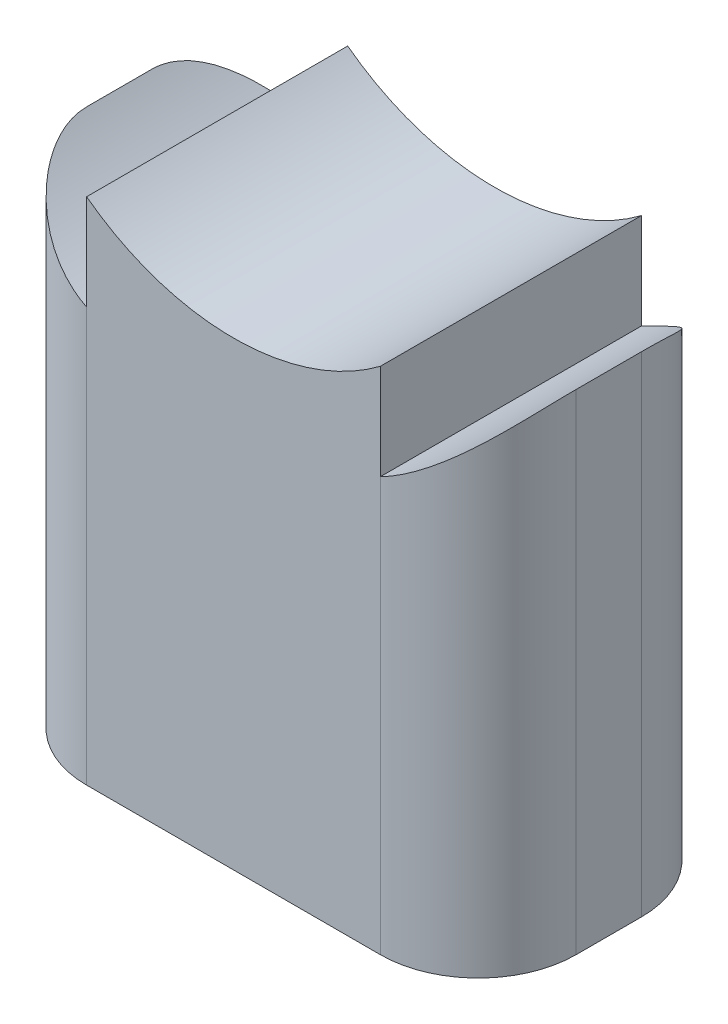
ISO-10303-21;
HEADER;
FILE_DESCRIPTION(('STEP AP214'),'2;1');
FILE_NAME('part.step','',(''),(''),'','','');
FILE_SCHEMA(('AUTOMOTIVE_DESIGN { 1 0 10303 214 1 1 1 1 }'));
ENDSEC;
DATA;
#1=APPLICATION_CONTEXT('core data for automotive mechanical design processes');
#2=APPLICATION_PROTOCOL_DEFINITION('international standard','automotive_design',2000,#1);
#3=PRODUCT_CONTEXT('',#1,'mechanical');
#4=PRODUCT('Part','Part','',(#3));
#5=PRODUCT_RELATED_PRODUCT_CATEGORY('part','',(#4));
#6=PRODUCT_DEFINITION_FORMATION('','',#4);
#7=PRODUCT_DEFINITION_CONTEXT('part definition',#1,'design');
#8=PRODUCT_DEFINITION('design','',#6,#7);
#9=PRODUCT_DEFINITION_SHAPE('','',#8);
#10=(LENGTH_UNIT() NAMED_UNIT(*) SI_UNIT(.MILLI.,.METRE.));
#11=(NAMED_UNIT(*) PLANE_ANGLE_UNIT() SI_UNIT($,.RADIAN.));
#12=(NAMED_UNIT(*) SI_UNIT($,.STERADIAN.) SOLID_ANGLE_UNIT());
#13=UNCERTAINTY_MEASURE_WITH_UNIT(LENGTH_MEASURE(1.E-05),#10,'distance_accuracy_value','');
#14=(GEOMETRIC_REPRESENTATION_CONTEXT(3) GLOBAL_UNCERTAINTY_ASSIGNED_CONTEXT((#13)) GLOBAL_UNIT_ASSIGNED_CONTEXT((#10,
#11,#12)) REPRESENTATION_CONTEXT('',''));
#15=CARTESIAN_POINT('',(0.,0.,0.));
#16=DIRECTION('',(0.,0.,1.));
#17=DIRECTION('',(1.,0.,0.));
#18=AXIS2_PLACEMENT_3D('',#15,#16,#17);
#19=CARTESIAN_POINT('',(0.,216.143782776615,-40.));
#20=DIRECTION('',(0.,0.,1.));
#21=DIRECTION('',(1.,0.,0.));
#22=AXIS2_PLACEMENT_3D('',#19,#20,#21);
#23=CYLINDRICAL_SURFACE('',#22,100.);
#24=DIRECTION('',(0.,0.,1.));
#25=VECTOR('',#24,1.);
#26=CARTESIAN_POINT('',(-45.,126.840927279156,-40.));
#27=LINE('',#26,#25);
#28=CARTESIAN_POINT('',(-45.,126.840927279156,-40.));
#29=VERTEX_POINT('',#28);
#30=CARTESIAN_POINT('',(-45.,126.840927279156,40.));
#31=VERTEX_POINT('',#30);
#32=EDGE_CURVE('E194',#29,#31,#27,.T.);
#33=ORIENTED_EDGE('',*,*,#32,.F.);
#34=CARTESIAN_POINT('',(-45.,126.840927279156,-40.));
#35=CARTESIAN_POINT('',(-45.5757367420864,127.13101910716,-40.0000043916286));
#36=CARTESIAN_POINT('',(-46.1485951016045,127.426688632291,-39.9834272360562));
#37=CARTESIAN_POINT('',(-47.2869642823122,128.028198258152,-39.9181331090478));
#38=CARTESIAN_POINT('',(-47.8524764832853,128.334036409407,-39.8694222647558));
#39=CARTESIAN_POINT('',(-48.97419085297,128.95468202613,-39.7409511060226));
#40=CARTESIAN_POINT('',(-49.5304022191007,129.269479682922,-39.6612236212749));
#41=CARTESIAN_POINT('',(-50.6328352703408,129.907352940028,-39.4717502912824));
#42=CARTESIAN_POINT('',(-51.1790564935028,130.230428921483,-39.3620030616401));
#43=CARTESIAN_POINT('',(-52.7960792554557,131.207610194835,-38.9903516916841));
#44=CARTESIAN_POINT('',(-53.8506817694574,131.872686801489,-38.6853967758538));
#45=CARTESIAN_POINT('',(-55.9084978112686,133.223603566237,-37.9677127816937));
#46=CARTESIAN_POINT('',(-56.9117032050814,133.909446983684,-37.5549667072047));
#47=CARTESIAN_POINT('',(-58.7101550104845,135.186146019313,-36.6995103673227));
#48=CARTESIAN_POINT('',(-59.5135672064256,135.775286396405,-36.2713083091998));
#49=CARTESIAN_POINT('',(-61.0765234708819,136.956552119113,-35.3450297279042));
#50=CARTESIAN_POINT('',(-61.8360742592796,137.548676992289,-34.8469639486644));
#51=CARTESIAN_POINT('',(-63.3093353038687,138.730470626186,-33.7822473124236));
#52=CARTESIAN_POINT('',(-64.0229940470094,139.320135955303,-33.2155213738746));
#53=CARTESIAN_POINT('',(-65.4004294573984,140.489308385403,-32.0149294224547));
#54=CARTESIAN_POINT('',(-66.0642108104681,141.068816436698,-31.3810697301004));
#55=CARTESIAN_POINT('',(-67.2439717505546,142.125005708197,-30.1450659397892));
#56=CARTESIAN_POINT('',(-67.7672944003767,142.604222870249,-29.5520867567658));
#57=CARTESIAN_POINT('',(-68.7722167484446,143.543129547488,-28.3170814680476));
#58=CARTESIAN_POINT('',(-69.2538151063079,144.002818435092,-27.675053787928));
#59=CARTESIAN_POINT('',(-70.1709975810188,144.89464422499,-26.3424107229824));
#60=CARTESIAN_POINT('',(-70.6066412481728,145.326816489281,-25.6518602000576));
#61=CARTESIAN_POINT('',(-71.4279195019786,146.155267804472,-24.22127970621));
#62=CARTESIAN_POINT('',(-71.8135725560361,146.551560093655,-23.4812681610499));
#63=CARTESIAN_POINT('',(-72.4283693562941,147.192571468004,-22.1676728703065));
#64=CARTESIAN_POINT('',(-72.6710120377248,147.448557183229,-21.6058733532663));
#65=CARTESIAN_POINT('',(-73.1250024914224,147.932024810267,-20.4577791702395));
#66=CARTESIAN_POINT('',(-73.3363519391253,148.159508247988,-19.8714858178064));
#67=CARTESIAN_POINT('',(-73.7243806102935,148.580497599438,-18.6777137425133));
#68=CARTESIAN_POINT('',(-73.901159678204,148.774101187723,-18.0703021813719));
#69=CARTESIAN_POINT('',(-74.2178927607972,149.123188286726,-16.8352586527849));
#70=CARTESIAN_POINT('',(-74.3578568773827,149.278682253798,-16.2076322853847));
#71=CARTESIAN_POINT('',(-74.5633646554144,149.508049705912,-15.1204185199746));
#72=CARTESIAN_POINT('',(-74.6387192259403,149.592516036522,-14.6648843785734));
#73=CARTESIAN_POINT('',(-74.7686469198415,149.738519246444,-13.7473000978595));
#74=CARTESIAN_POINT('',(-74.8232249874925,149.800061581006,-13.2852515359884));
#75=CARTESIAN_POINT('',(-74.9111792648944,149.89938918166,-12.3539819561348));
#76=CARTESIAN_POINT('',(-74.9444383983732,149.937043250188,-11.884735581579));
#77=CARTESIAN_POINT('',(-74.9777491159797,149.974776594265,-11.1790347049351));
#78=CARTESIAN_POINT('',(-74.9860897051302,149.984229771815,-10.9434153317746));
#79=CARTESIAN_POINT('',(-74.9972160162576,149.9968431029,-10.4718707647817));
#80=CARTESIAN_POINT('',(-75.0000015833147,150.000003080928,-10.235945562604));
#81=CARTESIAN_POINT('',(-75.,150.,-9.99999999999999));
#82=B_SPLINE_CURVE_WITH_KNOTS('',3,(#34,#35,#36,#37,#38,#39,#40,#41,#42,#43,#44,#45,#46,#47,#48,
#49,#50,#51,#52,#53,#54,#55,#56,#57,#58,#59,#60,#61,#62,#63,#64,#65,#66,#67,#68,#69,#70,#71,#72,
#73,#74,#75,#76,#77,#78,#79,#80,#81),.UNSPECIFIED.,.F.,.F.,(4,2,2,2,2,2,2,2,2,2,2,2,2,2,2,2,2,2,
2,2,2,2,2,4),(0.,1.93373682499357,3.86710503807327,5.79843241281823,7.72984886813047,
11.5739989773745,15.4187555860423,18.6688534359857,21.918452019257,25.1716367471907,
28.4245154657101,31.196495090179,33.9685637308117,36.7369948835055,39.504400396959,
41.4928534440562,43.4811999910881,45.4637162159867,47.4456878760424,48.8528758193174,
50.2597286782369,51.6742427561462,52.3819818572078,53.0897406955966),.UNSPECIFIED.);
#83=CARTESIAN_POINT('',(-75.,150.,-9.99999999999999));
#84=VERTEX_POINT('',#83);
#85=EDGE_CURVE('E58',#29,#84,#82,.T.);
#86=ORIENTED_EDGE('',*,*,#85,.T.);
#87=DIRECTION('',(0.,0.,1.));
#88=VECTOR('',#87,1.);
#89=CARTESIAN_POINT('',(-75.,150.,10.));
#90=LINE('',#89,#88);
#91=CARTESIAN_POINT('',(-75.,150.,10.));
#92=VERTEX_POINT('',#91);
#93=EDGE_CURVE('E117',#84,#92,#90,.T.);
#94=ORIENTED_EDGE('',*,*,#93,.T.);
#95=CARTESIAN_POINT('',(-75.,150.,10.));
#96=CARTESIAN_POINT('',(-75.0000133126668,150.000022064298,10.3370667137801));
#97=CARTESIAN_POINT('',(-74.994319631893,149.993559240963,10.6741231251936));
#98=CARTESIAN_POINT('',(-74.9716183500419,149.967828081114,11.3473322886263));
#99=CARTESIAN_POINT('',(-74.9546118857855,149.948561031296,11.6834851280377));
#100=CARTESIAN_POINT('',(-74.9094162855588,149.897420944785,12.3536092740827));
#101=CARTESIAN_POINT('',(-74.88124262037,149.865565348156,12.6875829517659));
#102=CARTESIAN_POINT('',(-74.8139118938575,149.78957311811,13.3529904915911));
#103=CARTESIAN_POINT('',(-74.7747546613717,149.74543629331,13.6844243140706));
#104=CARTESIAN_POINT('',(-74.6422321340662,149.596393677273,14.66582375264));
#105=CARTESIAN_POINT('',(-74.5332443380735,149.474203154693,15.3111921925557));
#106=CARTESIAN_POINT('',(-74.2757355100192,149.187438579709,16.5843485476158));
#107=CARTESIAN_POINT('',(-74.1272027806351,149.022851987091,17.2121312000893));
#108=CARTESIAN_POINT('',(-73.7944162737258,148.657155757755,18.4430934489828));
#109=CARTESIAN_POINT('',(-73.6103664349754,148.45625503456,19.0463907791157));
#110=CARTESIAN_POINT('',(-73.2089287722649,148.022273429952,20.2297004260501));
#111=CARTESIAN_POINT('',(-72.9915430780463,147.789194604409,20.8097142273911));
#112=CARTESIAN_POINT('',(-72.5253715836847,147.294772058602,21.94709115311));
#113=CARTESIAN_POINT('',(-72.2764817206426,147.033335096584,22.5043707241666));
#114=CARTESIAN_POINT('',(-71.7502887026518,146.487197623105,23.5936766677106));
#115=CARTESIAN_POINT('',(-71.4729782087793,146.20249110672,24.1256964653279));
#116=CARTESIAN_POINT('',(-70.9587309343327,145.681309603466,25.0450844298815));
#117=CARTESIAN_POINT('',(-70.727103544787,145.448731776328,25.4376638431497));
#118=CARTESIAN_POINT('',(-70.249184393319,144.973805531169,26.2075264400863));
#119=CARTESIAN_POINT('',(-70.0028952748135,144.731458876934,26.5848123605802));
#120=CARTESIAN_POINT('',(-69.2428625992919,143.991684961481,27.6942869053646));
#121=CARTESIAN_POINT('',(-68.708083718602,143.481656332986,28.4038615464788));
#122=CARTESIAN_POINT('',(-67.5870247250607,142.437731611342,29.7637023764313));
#123=CARTESIAN_POINT('',(-67.000680550353,141.90380624621,30.413892686565));
#124=CARTESIAN_POINT('',(-65.7808387480207,140.820835649799,31.6544042434227));
#125=CARTESIAN_POINT('',(-65.1473471329302,140.271792352058,32.2447331014438));
#126=CARTESIAN_POINT('',(-63.818339369038,139.150302103757,33.3806526749104));
#127=CARTESIAN_POINT('',(-63.1216041910508,138.577624929525,33.9245879661874));
#128=CARTESIAN_POINT('',(-61.6843071765857,137.429793171415,34.9481911023196));
#129=CARTESIAN_POINT('',(-60.9437437022896,136.854638495699,35.4278565432876));
#130=CARTESIAN_POINT('',(-59.4228851086399,135.708556118849,36.3202628192131));
#131=CARTESIAN_POINT('',(-58.642667384664,135.137622499828,36.7331279033618));
#132=CARTESIAN_POINT('',(-57.0439315919509,134.00396297045,37.4904705848756));
#133=CARTESIAN_POINT('',(-56.225413358297,133.441237095447,37.8349478877387));
#134=CARTESIAN_POINT('',(-54.5807890097564,132.3471194662,38.4420705166689));
#135=CARTESIAN_POINT('',(-53.7558199141377,131.815306049992,38.7070366019764));
#136=CARTESIAN_POINT('',(-52.0764142935332,130.767992606633,39.166449211865));
#137=CARTESIAN_POINT('',(-51.2219837549495,130.252489305705,39.36090997134));
#138=CARTESIAN_POINT('',(-49.9199727094106,129.493621729432,39.5971195982815));
#139=CARTESIAN_POINT('',(-49.4817240185231,129.242601342365,39.6666881643053));
#140=CARTESIAN_POINT('',(-48.5994547494037,128.746133544964,39.7866090505949));
#141=CARTESIAN_POINT('',(-48.155434317775,128.500685993512,39.8369618579617));
#142=CARTESIAN_POINT('',(-47.2619999318014,128.01568384997,39.917966024567));
#143=CARTESIAN_POINT('',(-46.8125824254702,127.7761334955,39.9486035926018));
#144=CARTESIAN_POINT('',(-45.9093723710968,127.303534099444,39.9896226248721));
#145=CARTESIAN_POINT('',(-45.4555793949131,127.070485702945,40.0000020862093));
#146=CARTESIAN_POINT('',(-45.,126.840927279156,40.));
#147=B_SPLINE_CURVE_WITH_KNOTS('',3,(#95,#96,#97,#98,#99,#100,#101,#102,#103,#104,#105,#106,
#107,#108,#109,#110,#111,#112,#113,#114,#115,#116,#117,#118,#119,#120,#121,#122,#123,#124,#125,
#126,#127,#128,#129,#130,#131,#132,#133,#134,#135,#136,#137,#138,#139,#140,#141,#142,#143,#144,
#145,#146),.UNSPECIFIED.,.F.,.F.,(4,2,2,2,2,2,2,2,2,2,2,2,2,2,2,2,2,2,2,2,2,2,2,2,2,4),(0.,
1.01107245881181,2.02204333037528,3.03161849431333,4.04120939181184,6.03544825299379,
8.0302776632218,10.013976429579,11.9975485153197,13.9878525170453,15.9786717666331,
17.5133055673147,19.04766351632,22.1172648607313,25.1907350852237,28.2638140311242,
31.420552599515,34.5774092065458,37.7283248023199,40.8792539667567,43.9264455026286,
46.9730214731652,48.5021218432234,50.0311834494829,51.5613135054821,53.0915948362193),.UNSPECIFIED.);
#148=EDGE_CURVE('E143',#92,#31,#147,.T.);
#149=ORIENTED_EDGE('',*,*,#148,.T.);
#150=EDGE_LOOP('',(#33,#86,#94,#149));
#151=FACE_BOUND('',#150,.T.);
#152=ADVANCED_FACE('F41',(#151),#23,.F.);
#153=CARTESIAN_POINT('',(-45.,150.,-9.99999999999999));
#154=DIRECTION('',(0.,-1.,0.));
#155=DIRECTION('',(0.,0.,-1.));
#156=AXIS2_PLACEMENT_3D('',#153,#154,#155);
#157=CYLINDRICAL_SURFACE('',#156,30.);
#158=ORIENTED_EDGE('',*,*,#85,.F.);
#159=DIRECTION('',(0.,-1.,0.));
#160=VECTOR('',#159,1.);
#161=CARTESIAN_POINT('',(-45.,150.,-40.));
#162=LINE('',#161,#160);
#163=CARTESIAN_POINT('',(-45.,0.,-40.));
#164=VERTEX_POINT('',#163);
#165=EDGE_CURVE('E103',#29,#164,#162,.T.);
#166=ORIENTED_EDGE('',*,*,#165,.T.);
#167=CARTESIAN_POINT('',(-45.,0.,-9.99999999999999));
#168=DIRECTION('',(0.,1.,0.));
#169=DIRECTION('',(0.,0.,-1.));
#170=AXIS2_PLACEMENT_3D('',#167,#168,#169);
#171=CIRCLE('',#170,30.);
#172=CARTESIAN_POINT('',(-75.,0.,-9.99999999999999));
#173=VERTEX_POINT('',#172);
#174=EDGE_CURVE('E116',#164,#173,#171,.T.);
#175=ORIENTED_EDGE('',*,*,#174,.T.);
#176=DIRECTION('',(0.,-1.,0.));
#177=VECTOR('',#176,1.);
#178=CARTESIAN_POINT('',(-75.,150.,-9.99999999999999));
#179=LINE('',#178,#177);
#180=EDGE_CURVE('E12',#84,#173,#179,.T.);
#181=ORIENTED_EDGE('',*,*,#180,.F.);
#182=EDGE_LOOP('',(#158,#166,#175,#181));
#183=FACE_BOUND('',#182,.T.);
#184=ADVANCED_FACE('F43',(#183),#157,.T.);
#185=CARTESIAN_POINT('',(-45.,150.,10.));
#186=DIRECTION('',(0.,-1.,0.));
#187=DIRECTION('',(0.,0.,-1.));
#188=AXIS2_PLACEMENT_3D('',#185,#186,#187);
#189=CYLINDRICAL_SURFACE('',#188,30.);
#190=ORIENTED_EDGE('',*,*,#148,.F.);
#191=DIRECTION('',(0.,-1.,0.));
#192=VECTOR('',#191,1.);
#193=CARTESIAN_POINT('',(-75.,150.,10.));
#194=LINE('',#193,#192);
#195=CARTESIAN_POINT('',(-75.,0.,10.));
#196=VERTEX_POINT('',#195);
#197=EDGE_CURVE('E51',#92,#196,#194,.T.);
#198=ORIENTED_EDGE('',*,*,#197,.T.);
#199=CARTESIAN_POINT('',(-45.,0.,10.));
#200=DIRECTION('',(0.,1.,0.));
#201=DIRECTION('',(0.,0.,-1.));
#202=AXIS2_PLACEMENT_3D('',#199,#200,#201);
#203=CIRCLE('',#202,30.);
#204=CARTESIAN_POINT('',(-45.,0.,40.));
#205=VERTEX_POINT('',#204);
#206=EDGE_CURVE('E139',#196,#205,#203,.T.);
#207=ORIENTED_EDGE('',*,*,#206,.T.);
#208=DIRECTION('',(0.,-1.,0.));
#209=VECTOR('',#208,1.);
#210=CARTESIAN_POINT('',(-45.,150.,40.));
#211=LINE('',#210,#209);
#212=EDGE_CURVE('E130',#31,#205,#211,.T.);
#213=ORIENTED_EDGE('',*,*,#212,.F.);
#214=EDGE_LOOP('',(#190,#198,#207,#213));
#215=FACE_BOUND('',#214,.T.);
#216=ADVANCED_FACE('F137',(#215),#189,.T.);
#217=CARTESIAN_POINT('',(-45.,150.,40.));
#218=DIRECTION('',(0.,0.,-1.));
#219=DIRECTION('',(-1.,0.,0.));
#220=AXIS2_PLACEMENT_3D('',#217,#218,#219);
#221=PLANE('',#220);
#222=DIRECTION('',(0.,-1.,0.));
#223=VECTOR('',#222,1.);
#224=CARTESIAN_POINT('',(45.,150.,40.));
#225=LINE('',#224,#223);
#226=CARTESIAN_POINT('',(45.,126.840927279156,40.));
#227=VERTEX_POINT('',#226);
#228=CARTESIAN_POINT('',(45.,0.,40.));
#229=VERTEX_POINT('',#228);
#230=EDGE_CURVE('E128',#227,#229,#225,.T.);
#231=ORIENTED_EDGE('',*,*,#230,.F.);
#232=DIRECTION('',(0.,1.,0.));
#233=VECTOR('',#232,1.);
#234=CARTESIAN_POINT('',(45.,156.143782776615,40.));
#235=LINE('',#234,#233);
#236=CARTESIAN_POINT('',(45.,156.143782776615,40.));
#237=VERTEX_POINT('',#236);
#238=EDGE_CURVE('E248',#227,#237,#235,.T.);
#239=ORIENTED_EDGE('',*,*,#238,.T.);
#240=CARTESIAN_POINT('',(0.,216.143782776615,40.));
#241=DIRECTION('',(0.,0.,-1.));
#242=DIRECTION('',(1.,0.,0.));
#243=AXIS2_PLACEMENT_3D('',#240,#241,#242);
#244=CIRCLE('',#243,75.);
#245=CARTESIAN_POINT('',(-45.,156.143782776615,40.));
#246=VERTEX_POINT('',#245);
#247=EDGE_CURVE('E250',#237,#246,#244,.T.);
#248=ORIENTED_EDGE('',*,*,#247,.T.);
#249=DIRECTION('',(0.,-1.,0.));
#250=VECTOR('',#249,1.);
#251=CARTESIAN_POINT('',(-45.,126.840927279156,40.));
#252=LINE('',#251,#250);
#253=EDGE_CURVE('E174',#246,#31,#252,.T.);
#254=ORIENTED_EDGE('',*,*,#253,.T.);
#255=ORIENTED_EDGE('',*,*,#212,.T.);
#256=DIRECTION('',(1.,0.,0.));
#257=VECTOR('',#256,1.);
#258=CARTESIAN_POINT('',(-45.,0.,40.));
#259=LINE('',#258,#257);
#260=EDGE_CURVE('E148',#205,#229,#259,.T.);
#261=ORIENTED_EDGE('',*,*,#260,.T.);
#262=EDGE_LOOP('',(#231,#239,#248,#254,#255,#261));
#263=FACE_BOUND('',#262,.T.);
#264=ADVANCED_FACE('F169',(#263),#221,.F.);
#265=CARTESIAN_POINT('',(45.,150.,10.));
#266=DIRECTION('',(0.,-1.,0.));
#267=DIRECTION('',(0.,0.,-1.));
#268=AXIS2_PLACEMENT_3D('',#265,#266,#267);
#269=CYLINDRICAL_SURFACE('',#268,30.);
#270=CARTESIAN_POINT('',(45.,126.840927279156,40.));
#271=CARTESIAN_POINT('',(45.5757367420864,127.13101910716,40.0000043916287));
#272=CARTESIAN_POINT('',(46.1485951016045,127.426688632291,39.9834272360562));
#273=CARTESIAN_POINT('',(47.2869642823122,128.028198258152,39.9181331090478));
#274=CARTESIAN_POINT('',(47.8524764832853,128.334036409407,39.8694222647559));
#275=CARTESIAN_POINT('',(48.97419085297,128.95468202613,39.7409511060226));
#276=CARTESIAN_POINT('',(49.5304022191007,129.269479682922,39.6612236212749));
#277=CARTESIAN_POINT('',(50.6328352703409,129.907352940028,39.4717502912824));
#278=CARTESIAN_POINT('',(51.1790564935028,130.230428921483,39.3620030616401));
#279=CARTESIAN_POINT('',(52.7960792554557,131.207610194835,38.9903516916841));
#280=CARTESIAN_POINT('',(53.8506817694574,131.872686801489,38.6853967758539));
#281=CARTESIAN_POINT('',(55.9084978112686,133.223603566237,37.9677127816937));
#282=CARTESIAN_POINT('',(56.9117032050814,133.909446983684,37.5549667072047));
#283=CARTESIAN_POINT('',(58.7101550104845,135.186146019313,36.6995103673227));
#284=CARTESIAN_POINT('',(59.5135672064257,135.775286396405,36.2713083091998));
#285=CARTESIAN_POINT('',(61.0765234708819,136.956552119113,35.3450297279042));
#286=CARTESIAN_POINT('',(61.8360742592796,137.548676992289,34.8469639486643));
#287=CARTESIAN_POINT('',(63.3093353038687,138.730470626186,33.7822473124236));
#288=CARTESIAN_POINT('',(64.0229940470094,139.320135955303,33.2155213738746));
#289=CARTESIAN_POINT('',(65.4004294573985,140.489308385403,32.0149294224547));
#290=CARTESIAN_POINT('',(66.0642108104681,141.068816436698,31.3810697301004));
#291=CARTESIAN_POINT('',(67.2439717505546,142.125005708197,30.1450659397892));
#292=CARTESIAN_POINT('',(67.7672944003767,142.604222870249,29.5520867567658));
#293=CARTESIAN_POINT('',(68.7722167484446,143.543129547488,28.3170814680476));
#294=CARTESIAN_POINT('',(69.2538151063079,144.002818435092,27.675053787928));
#295=CARTESIAN_POINT('',(70.1709975810188,144.89464422499,26.3424107229824));
#296=CARTESIAN_POINT('',(70.6066412481729,145.326816489281,25.6518602000576));
#297=CARTESIAN_POINT('',(71.4279195019786,146.155267804472,24.22127970621));
#298=CARTESIAN_POINT('',(71.8135725560361,146.551560093655,23.4812681610498));
#299=CARTESIAN_POINT('',(72.4283693562941,147.192571468004,22.1676728703065));
#300=CARTESIAN_POINT('',(72.6710120377249,147.448557183229,21.6058733532663));
#301=CARTESIAN_POINT('',(73.1250024914224,147.932024810267,20.4577791702395));
#302=CARTESIAN_POINT('',(73.3363519391253,148.159508247988,19.8714858178063));
#303=CARTESIAN_POINT('',(73.7243806102935,148.580497599438,18.6777137425133));
#304=CARTESIAN_POINT('',(73.901159678204,148.774101187723,18.0703021813719));
#305=CARTESIAN_POINT('',(74.2178927607972,149.123188286726,16.8352586527849));
#306=CARTESIAN_POINT('',(74.3578568773827,149.278682253798,16.2076322853847));
#307=CARTESIAN_POINT('',(74.5633646554144,149.508049705912,15.1204185199746));
#308=CARTESIAN_POINT('',(74.6387192259403,149.592516036522,14.6648843785734));
#309=CARTESIAN_POINT('',(74.7686469198415,149.738519246444,13.7473000978595));
#310=CARTESIAN_POINT('',(74.8232249874925,149.800061581006,13.2852515359884));
#311=CARTESIAN_POINT('',(74.9111792648944,149.89938918166,12.3539819561348));
#312=CARTESIAN_POINT('',(74.9444383983732,149.937043250188,11.884735581579));
#313=CARTESIAN_POINT('',(74.9777491159797,149.974776594265,11.1790347049352));
#314=CARTESIAN_POINT('',(74.9860897051302,149.984229771815,10.9434153317746));
#315=CARTESIAN_POINT('',(74.9972160162576,149.9968431029,10.4718707647817));
#316=CARTESIAN_POINT('',(75.0000015833147,150.000003080928,10.235945562604));
#317=CARTESIAN_POINT('',(75.,150.,10.));
#318=B_SPLINE_CURVE_WITH_KNOTS('',3,(#270,#271,#272,#273,#274,#275,#276,#277,#278,#279,#280,
#281,#282,#283,#284,#285,#286,#287,#288,#289,#290,#291,#292,#293,#294,#295,#296,#297,#298,#299,
#300,#301,#302,#303,#304,#305,#306,#307,#308,#309,#310,#311,#312,#313,#314,#315,#316,#317),
.UNSPECIFIED.,.F.,.F.,(4,2,2,2,2,2,2,2,2,2,2,2,2,2,2,2,2,2,2,2,2,2,2,4),(0.,1.93373682499357,
3.86710503807327,5.79843241281827,7.72984886813047,11.5739989773745,15.4187555860423,
18.6688534359858,21.918452019257,25.1716367471907,28.4245154657102,31.196495090179,
33.9685637308117,36.7369948835055,39.504400396959,41.4928534440562,43.4811999910881,
45.4637162159868,47.4456878760424,48.8528758193174,50.2597286782369,51.6742427561462,
52.3819818572078,53.0897406955965),.UNSPECIFIED.);
#319=CARTESIAN_POINT('',(75.,150.,10.));
#320=VERTEX_POINT('',#319);
#321=EDGE_CURVE('E166',#227,#320,#318,.T.);
#322=ORIENTED_EDGE('',*,*,#321,.F.);
#323=ORIENTED_EDGE('',*,*,#230,.T.);
#324=CARTESIAN_POINT('',(45.,0.,10.));
#325=DIRECTION('',(0.,1.,0.));
#326=DIRECTION('',(0.,0.,1.));
#327=AXIS2_PLACEMENT_3D('',#324,#325,#326);
#328=CIRCLE('',#327,30.);
#329=CARTESIAN_POINT('',(75.,0.,10.));
#330=VERTEX_POINT('',#329);
#331=EDGE_CURVE('E150',#229,#330,#328,.T.);
#332=ORIENTED_EDGE('',*,*,#331,.T.);
#333=DIRECTION('',(0.,-1.,0.));
#334=VECTOR('',#333,1.);
#335=CARTESIAN_POINT('',(75.,150.,10.));
#336=LINE('',#335,#334);
#337=EDGE_CURVE('E125',#320,#330,#336,.T.);
#338=ORIENTED_EDGE('',*,*,#337,.F.);
#339=EDGE_LOOP('',(#322,#323,#332,#338));
#340=FACE_BOUND('',#339,.T.);
#341=ADVANCED_FACE('F162',(#340),#269,.T.);
#342=CARTESIAN_POINT('',(45.,150.,-9.99999999999999));
#343=DIRECTION('',(0.,-1.,0.));
#344=DIRECTION('',(0.,0.,-1.));
#345=AXIS2_PLACEMENT_3D('',#342,#343,#344);
#346=CYLINDRICAL_SURFACE('',#345,30.);
#347=CARTESIAN_POINT('',(75.,150.,-10.));
#348=CARTESIAN_POINT('',(75.0000133126668,150.000022064298,-10.33706671378));
#349=CARTESIAN_POINT('',(74.994319631893,149.993559240963,-10.6741231251935));
#350=CARTESIAN_POINT('',(74.971618350042,149.967828081114,-11.3473322886262));
#351=CARTESIAN_POINT('',(74.9546118857855,149.948561031296,-11.6834851280377));
#352=CARTESIAN_POINT('',(74.9094162855588,149.897420944785,-12.3536092740826));
#353=CARTESIAN_POINT('',(74.88124262037,149.865565348156,-12.6875829517659));
#354=CARTESIAN_POINT('',(74.8139118938575,149.78957311811,-13.3529904915911));
#355=CARTESIAN_POINT('',(74.7747546613717,149.74543629331,-13.6844243140706));
#356=CARTESIAN_POINT('',(74.6422321340662,149.596393677273,-14.66582375264));
#357=CARTESIAN_POINT('',(74.5332443380735,149.474203154693,-15.3111921925557));
#358=CARTESIAN_POINT('',(74.2757355100192,149.187438579709,-16.5843485476158));
#359=CARTESIAN_POINT('',(74.1272027806351,149.022851987091,-17.2121312000893));
#360=CARTESIAN_POINT('',(73.7944162737258,148.657155757754,-18.4430934489828));
#361=CARTESIAN_POINT('',(73.6103664349754,148.45625503456,-19.0463907791157));
#362=CARTESIAN_POINT('',(73.2089287722649,148.022273429952,-20.2297004260501));
#363=CARTESIAN_POINT('',(72.9915430780463,147.789194604409,-20.8097142273911));
#364=CARTESIAN_POINT('',(72.5253715836847,147.294772058602,-21.94709115311));
#365=CARTESIAN_POINT('',(72.2764817206426,147.033335096584,-22.5043707241666));
#366=CARTESIAN_POINT('',(71.7502887026518,146.487197623105,-23.5936766677106));
#367=CARTESIAN_POINT('',(71.4729782087793,146.20249110672,-24.1256964653279));
#368=CARTESIAN_POINT('',(70.9587309343327,145.681309603466,-25.0450844298815));
#369=CARTESIAN_POINT('',(70.727103544787,145.448731776328,-25.4376638431497));
#370=CARTESIAN_POINT('',(70.249184393319,144.973805531169,-26.2075264400863));
#371=CARTESIAN_POINT('',(70.0028952748135,144.731458876934,-26.5848123605801));
#372=CARTESIAN_POINT('',(69.2428625992919,143.991684961481,-27.6942869053646));
#373=CARTESIAN_POINT('',(68.708083718602,143.481656332986,-28.4038615464788));
#374=CARTESIAN_POINT('',(67.5870247250607,142.437731611342,-29.7637023764313));
#375=CARTESIAN_POINT('',(67.000680550353,141.90380624621,-30.413892686565));
#376=CARTESIAN_POINT('',(65.7808387480207,140.820835649799,-31.6544042434227));
#377=CARTESIAN_POINT('',(65.1473471329302,140.271792352058,-32.2447331014438));
#378=CARTESIAN_POINT('',(63.818339369038,139.150302103757,-33.3806526749104));
#379=CARTESIAN_POINT('',(63.1216041910508,138.577624929525,-33.9245879661874));
#380=CARTESIAN_POINT('',(61.6843071765857,137.429793171415,-34.9481911023195));
#381=CARTESIAN_POINT('',(60.9437437022896,136.854638495699,-35.4278565432876));
#382=CARTESIAN_POINT('',(59.4228851086399,135.708556118849,-36.3202628192131));
#383=CARTESIAN_POINT('',(58.642667384664,135.137622499828,-36.7331279033618));
#384=CARTESIAN_POINT('',(57.0439315919509,134.00396297045,-37.4904705848756));
#385=CARTESIAN_POINT('',(56.225413358297,133.441237095447,-37.8349478877387));
#386=CARTESIAN_POINT('',(54.5807890097564,132.3471194662,-38.4420705166689));
#387=CARTESIAN_POINT('',(53.7558199141377,131.815306049992,-38.7070366019764));
#388=CARTESIAN_POINT('',(52.0764142935332,130.767992606633,-39.166449211865));
#389=CARTESIAN_POINT('',(51.2219837549495,130.252489305705,-39.3609099713399));
#390=CARTESIAN_POINT('',(49.9199727094106,129.493621729432,-39.5971195982815));
#391=CARTESIAN_POINT('',(49.4817240185231,129.242601342365,-39.6666881643053));
#392=CARTESIAN_POINT('',(48.5994547494037,128.746133544964,-39.7866090505949));
#393=CARTESIAN_POINT('',(48.155434317775,128.500685993512,-39.8369618579617));
#394=CARTESIAN_POINT('',(47.2619999318014,128.01568384997,-39.917966024567));
#395=CARTESIAN_POINT('',(46.8125824254702,127.7761334955,-39.9486035926018));
#396=CARTESIAN_POINT('',(45.9093723710968,127.303534099444,-39.9896226248721));
#397=CARTESIAN_POINT('',(45.4555793949131,127.070485702945,-40.0000020862093));
#398=CARTESIAN_POINT('',(45.,126.840927279156,-40.));
#399=B_SPLINE_CURVE_WITH_KNOTS('',3,(#347,#348,#349,#350,#351,#352,#353,#354,#355,#356,#357,
#358,#359,#360,#361,#362,#363,#364,#365,#366,#367,#368,#369,#370,#371,#372,#373,#374,#375,#376,
#377,#378,#379,#380,#381,#382,#383,#384,#385,#386,#387,#388,#389,#390,#391,#392,#393,#394,#395,
#396,#397,#398),.UNSPECIFIED.,.F.,.F.,(4,2,2,2,2,2,2,2,2,2,2,2,2,2,2,2,2,2,2,2,2,2,2,2,2,4),(0.,
1.0110724588118,2.02204333037528,3.03161849431333,4.04120939181184,6.0354482529938,
8.03027766322181,10.013976429579,11.9975485153197,13.9878525170453,15.9786717666331,
17.5133055673147,19.04766351632,22.1172648607313,25.1907350852237,28.2638140311242,
31.420552599515,34.5774092065458,37.7283248023199,40.8792539667567,43.9264455026286,
46.9730214731652,48.5021218432234,50.0311834494829,51.5613135054821,53.0915948362193),.UNSPECIFIED.);
#400=CARTESIAN_POINT('',(75.,150.,-9.99999999999999));
#401=VERTEX_POINT('',#400);
#402=CARTESIAN_POINT('',(45.,126.840927279156,-40.));
#403=VERTEX_POINT('',#402);
#404=EDGE_CURVE('E191',#401,#403,#399,.T.);
#405=ORIENTED_EDGE('',*,*,#404,.F.);
#406=DIRECTION('',(0.,-1.,0.));
#407=VECTOR('',#406,1.);
#408=CARTESIAN_POINT('',(75.,150.,-9.99999999999999));
#409=LINE('',#408,#407);
#410=CARTESIAN_POINT('',(75.,0.,-9.99999999999999));
#411=VERTEX_POINT('',#410);
#412=EDGE_CURVE('E102',#401,#411,#409,.T.);
#413=ORIENTED_EDGE('',*,*,#412,.T.);
#414=CARTESIAN_POINT('',(45.,0.,-9.99999999999999));
#415=DIRECTION('',(0.,1.,0.));
#416=DIRECTION('',(0.,0.,-1.));
#417=AXIS2_PLACEMENT_3D('',#414,#415,#416);
#418=CIRCLE('',#417,30.);
#419=CARTESIAN_POINT('',(45.,0.,-40.));
#420=VERTEX_POINT('',#419);
#421=EDGE_CURVE('E107',#411,#420,#418,.T.);
#422=ORIENTED_EDGE('',*,*,#421,.T.);
#423=DIRECTION('',(0.,-1.,0.));
#424=VECTOR('',#423,1.);
#425=CARTESIAN_POINT('',(45.,150.,-40.));
#426=LINE('',#425,#424);
#427=EDGE_CURVE('E88',#403,#420,#426,.T.);
#428=ORIENTED_EDGE('',*,*,#427,.F.);
#429=EDGE_LOOP('',(#405,#413,#422,#428));
#430=FACE_BOUND('',#429,.T.);
#431=ADVANCED_FACE('F108',(#430),#346,.T.);
#432=CARTESIAN_POINT('',(-45.,150.,-40.));
#433=DIRECTION('',(0.,0.,1.));
#434=DIRECTION('',(1.,0.,0.));
#435=AXIS2_PLACEMENT_3D('',#432,#433,#434);
#436=PLANE('',#435);
#437=ORIENTED_EDGE('',*,*,#165,.F.);
#438=DIRECTION('',(0.,-1.,0.));
#439=VECTOR('',#438,1.);
#440=CARTESIAN_POINT('',(-45.,126.840927279156,-40.));
#441=LINE('',#440,#439);
#442=CARTESIAN_POINT('',(-45.,156.143782776615,-40.));
#443=VERTEX_POINT('',#442);
#444=EDGE_CURVE('E236',#443,#29,#441,.T.);
#445=ORIENTED_EDGE('',*,*,#444,.F.);
#446=CARTESIAN_POINT('',(0.,216.143782776615,-40.));
#447=DIRECTION('',(0.,0.,-1.));
#448=DIRECTION('',(1.,0.,0.));
#449=AXIS2_PLACEMENT_3D('',#446,#447,#448);
#450=CIRCLE('',#449,75.);
#451=CARTESIAN_POINT('',(45.,156.143782776615,-40.));
#452=VERTEX_POINT('',#451);
#453=EDGE_CURVE('E239',#452,#443,#450,.T.);
#454=ORIENTED_EDGE('',*,*,#453,.F.);
#455=DIRECTION('',(0.,1.,0.));
#456=VECTOR('',#455,1.);
#457=CARTESIAN_POINT('',(45.,156.143782776615,-40.));
#458=LINE('',#457,#456);
#459=EDGE_CURVE('E98',#403,#452,#458,.T.);
#460=ORIENTED_EDGE('',*,*,#459,.F.);
#461=ORIENTED_EDGE('',*,*,#427,.T.);
#462=DIRECTION('',(-1.,0.,0.));
#463=VECTOR('',#462,1.);
#464=CARTESIAN_POINT('',(-45.,0.,-40.));
#465=LINE('',#464,#463);
#466=EDGE_CURVE('E93',#420,#164,#465,.T.);
#467=ORIENTED_EDGE('',*,*,#466,.T.);
#468=EDGE_LOOP('',(#437,#445,#454,#460,#461,#467));
#469=FACE_BOUND('',#468,.T.);
#470=ADVANCED_FACE('F91',(#469),#436,.F.);
#471=CARTESIAN_POINT('',(-75.,150.,10.));
#472=DIRECTION('',(1.,0.,0.));
#473=DIRECTION('',(0.,0.,-1.));
#474=AXIS2_PLACEMENT_3D('',#471,#472,#473);
#475=PLANE('',#474);
#476=DIRECTION('',(0.,0.,1.));
#477=VECTOR('',#476,1.);
#478=CARTESIAN_POINT('',(-75.,0.,10.));
#479=LINE('',#478,#477);
#480=EDGE_CURVE('E145',#173,#196,#479,.T.);
#481=ORIENTED_EDGE('',*,*,#480,.T.);
#482=ORIENTED_EDGE('',*,*,#197,.F.);
#483=ORIENTED_EDGE('',*,*,#93,.F.);
#484=ORIENTED_EDGE('',*,*,#180,.T.);
#485=EDGE_LOOP('',(#481,#482,#483,#484));
#486=FACE_BOUND('',#485,.T.);
#487=ADVANCED_FACE('F265',(#486),#475,.F.);
#488=CARTESIAN_POINT('',(75.,150.,10.));
#489=DIRECTION('',(-1.,0.,0.));
#490=DIRECTION('',(0.,0.,1.));
#491=AXIS2_PLACEMENT_3D('',#488,#489,#490);
#492=PLANE('',#491);
#493=DIRECTION('',(0.,0.,-1.));
#494=VECTOR('',#493,1.);
#495=CARTESIAN_POINT('',(75.,0.,10.));
#496=LINE('',#495,#494);
#497=EDGE_CURVE('E112',#330,#411,#496,.T.);
#498=ORIENTED_EDGE('',*,*,#497,.T.);
#499=ORIENTED_EDGE('',*,*,#412,.F.);
#500=DIRECTION('',(0.,0.,-1.));
#501=VECTOR('',#500,1.);
#502=CARTESIAN_POINT('',(75.,150.,10.));
#503=LINE('',#502,#501);
#504=EDGE_CURVE('E119',#320,#401,#503,.T.);
#505=ORIENTED_EDGE('',*,*,#504,.F.);
#506=ORIENTED_EDGE('',*,*,#337,.T.);
#507=EDGE_LOOP('',(#498,#499,#505,#506));
#508=FACE_BOUND('',#507,.T.);
#509=ADVANCED_FACE('F156',(#508),#492,.F.);
#510=CARTESIAN_POINT('',(-45.,0.,-9.99999999999999));
#511=DIRECTION('',(0.,-1.,0.));
#512=DIRECTION('',(0.,0.,-1.));
#513=AXIS2_PLACEMENT_3D('',#510,#511,#512);
#514=PLANE('',#513);
#515=ORIENTED_EDGE('',*,*,#174,.F.);
#516=ORIENTED_EDGE('',*,*,#466,.F.);
#517=ORIENTED_EDGE('',*,*,#421,.F.);
#518=ORIENTED_EDGE('',*,*,#497,.F.);
#519=ORIENTED_EDGE('',*,*,#331,.F.);
#520=ORIENTED_EDGE('',*,*,#260,.F.);
#521=ORIENTED_EDGE('',*,*,#206,.F.);
#522=ORIENTED_EDGE('',*,*,#480,.F.);
#523=EDGE_LOOP('',(#515,#516,#517,#518,#519,#520,#521,#522));
#524=FACE_BOUND('',#523,.T.);
#525=ADVANCED_FACE('F114',(#524),#514,.T.);
#526=DIRECTION('',(0.,0.,1.));
#527=VECTOR('',#526,1.);
#528=CARTESIAN_POINT('',(45.,126.840927279156,-40.));
#529=LINE('',#528,#527);
#530=EDGE_CURVE('E190',#403,#227,#529,.T.);
#531=ORIENTED_EDGE('',*,*,#530,.T.);
#532=ORIENTED_EDGE('',*,*,#321,.T.);
#533=ORIENTED_EDGE('',*,*,#504,.T.);
#534=ORIENTED_EDGE('',*,*,#404,.T.);
#535=EDGE_LOOP('',(#531,#532,#533,#534));
#536=FACE_BOUND('',#535,.T.);
#537=ADVANCED_FACE('F188',(#536),#23,.F.);
#538=CARTESIAN_POINT('',(-45.,126.840927279156,-40.));
#539=DIRECTION('',(-1.,0.,0.));
#540=DIRECTION('',(0.,-1.,0.));
#541=AXIS2_PLACEMENT_3D('',#538,#539,#540);
#542=PLANE('',#541);
#543=ORIENTED_EDGE('',*,*,#253,.F.);
#544=DIRECTION('',(0.,0.,1.));
#545=VECTOR('',#544,1.);
#546=CARTESIAN_POINT('',(-45.,156.143782776615,-40.));
#547=LINE('',#546,#545);
#548=EDGE_CURVE('E254',#443,#246,#547,.T.);
#549=ORIENTED_EDGE('',*,*,#548,.F.);
#550=ORIENTED_EDGE('',*,*,#444,.T.);
#551=ORIENTED_EDGE('',*,*,#32,.T.);
#552=EDGE_LOOP('',(#543,#549,#550,#551));
#553=FACE_BOUND('',#552,.T.);
#554=ADVANCED_FACE('F221',(#553),#542,.T.);
#555=CARTESIAN_POINT('',(0.,216.143782776615,-40.));
#556=DIRECTION('',(0.,0.,1.));
#557=DIRECTION('',(1.,0.,0.));
#558=AXIS2_PLACEMENT_3D('',#555,#556,#557);
#559=CYLINDRICAL_SURFACE('',#558,75.);
#560=ORIENTED_EDGE('',*,*,#247,.F.);
#561=DIRECTION('',(0.,0.,1.));
#562=VECTOR('',#561,1.);
#563=CARTESIAN_POINT('',(45.,156.143782776615,-40.));
#564=LINE('',#563,#562);
#565=EDGE_CURVE('E244',#452,#237,#564,.T.);
#566=ORIENTED_EDGE('',*,*,#565,.F.);
#567=ORIENTED_EDGE('',*,*,#453,.T.);
#568=ORIENTED_EDGE('',*,*,#548,.T.);
#569=EDGE_LOOP('',(#560,#566,#567,#568));
#570=FACE_BOUND('',#569,.T.);
#571=ADVANCED_FACE('F264',(#570),#559,.F.);
#572=CARTESIAN_POINT('',(45.,156.143782776615,-40.));
#573=DIRECTION('',(1.,0.,0.));
#574=DIRECTION('',(0.,1.,0.));
#575=AXIS2_PLACEMENT_3D('',#572,#573,#574);
#576=PLANE('',#575);
#577=ORIENTED_EDGE('',*,*,#238,.F.);
#578=ORIENTED_EDGE('',*,*,#530,.F.);
#579=ORIENTED_EDGE('',*,*,#459,.T.);
#580=ORIENTED_EDGE('',*,*,#565,.T.);
#581=EDGE_LOOP('',(#577,#578,#579,#580));
#582=FACE_BOUND('',#581,.T.);
#583=ADVANCED_FACE('F222',(#582),#576,.T.);
#584=CLOSED_SHELL('',(#152,#184,#216,#264,#341,#431,#470,#487,#509,#525,#537,#554,#571,#583));
#585=MANIFOLD_SOLID_BREP('B2',#584);
#586=ADVANCED_BREP_SHAPE_REPRESENTATION('',(#18,#585),#14);
#587=SHAPE_DEFINITION_REPRESENTATION(#9,#586);
ENDSEC;
END-ISO-10303-21;
